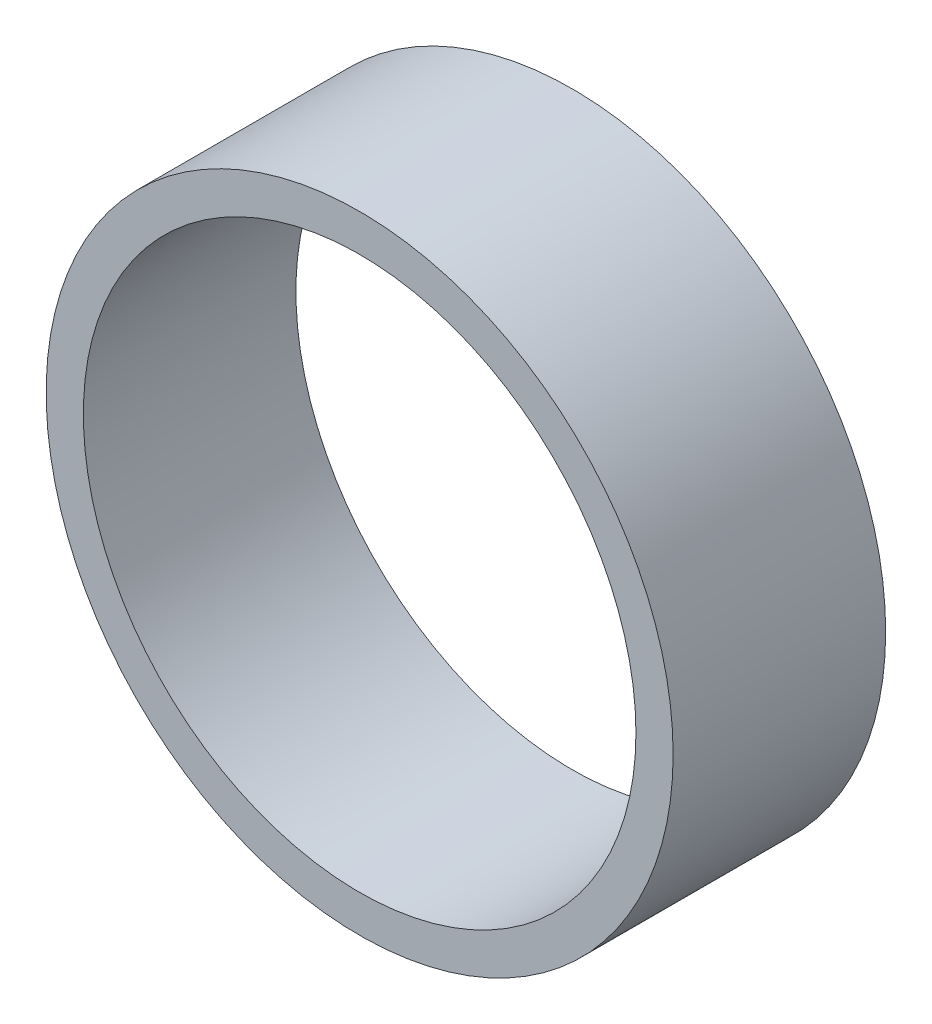
ISO-10303-21;
HEADER;
FILE_DESCRIPTION(('STEP AP214'),'2;1');
FILE_NAME('part.step','',(''),(''),'','','');
FILE_SCHEMA(('AUTOMOTIVE_DESIGN { 1 0 10303 214 1 1 1 1 }'));
ENDSEC;
DATA;
#1=APPLICATION_CONTEXT('core data for automotive mechanical design processes');
#2=APPLICATION_PROTOCOL_DEFINITION('international standard','automotive_design',2000,#1);
#3=PRODUCT_CONTEXT('',#1,'mechanical');
#4=PRODUCT('Part','Part','',(#3));
#5=PRODUCT_RELATED_PRODUCT_CATEGORY('part','',(#4));
#6=PRODUCT_DEFINITION_FORMATION('','',#4);
#7=PRODUCT_DEFINITION_CONTEXT('part definition',#1,'design');
#8=PRODUCT_DEFINITION('design','',#6,#7);
#9=PRODUCT_DEFINITION_SHAPE('','',#8);
#10=(LENGTH_UNIT() NAMED_UNIT(*) SI_UNIT(.MILLI.,.METRE.));
#11=(NAMED_UNIT(*) PLANE_ANGLE_UNIT() SI_UNIT($,.RADIAN.));
#12=(NAMED_UNIT(*) SI_UNIT($,.STERADIAN.) SOLID_ANGLE_UNIT());
#13=UNCERTAINTY_MEASURE_WITH_UNIT(LENGTH_MEASURE(1.E-05),#10,'distance_accuracy_value','');
#14=(GEOMETRIC_REPRESENTATION_CONTEXT(3) GLOBAL_UNCERTAINTY_ASSIGNED_CONTEXT((#13)) GLOBAL_UNIT_ASSIGNED_CONTEXT((#10,
#11,#12)) REPRESENTATION_CONTEXT('',''));
#15=CARTESIAN_POINT('',(0.,0.,0.));
#16=DIRECTION('',(0.,0.,1.));
#17=DIRECTION('',(1.,0.,0.));
#18=AXIS2_PLACEMENT_3D('',#15,#16,#17);
#19=CARTESIAN_POINT('',(0.,0.,10.));
#20=DIRECTION('',(0.,0.,1.));
#21=DIRECTION('',(1.,0.,0.));
#22=AXIS2_PLACEMENT_3D('',#19,#20,#21);
#23=PLANE('',#22);
#24=CARTESIAN_POINT('',(0.,0.,10.));
#25=DIRECTION('',(0.,0.,1.));
#26=DIRECTION('',(1.,0.,0.));
#27=AXIS2_PLACEMENT_3D('',#24,#25,#26);
#28=CIRCLE('',#27,14.75);
#29=CARTESIAN_POINT('',(14.75,0.,10.));
#30=VERTEX_POINT('',#29);
#31=EDGE_CURVE('E10',#30,#30,#28,.T.);
#32=ORIENTED_EDGE('',*,*,#31,.T.);
#33=EDGE_LOOP('',(#32));
#34=FACE_BOUND('',#33,.T.);
#35=CARTESIAN_POINT('',(0.,0.,10.));
#36=DIRECTION('',(0.,0.,1.));
#37=DIRECTION('',(1.,0.,0.));
#38=AXIS2_PLACEMENT_3D('',#35,#36,#37);
#39=CIRCLE('',#38,13.);
#40=CARTESIAN_POINT('',(13.,0.,10.));
#41=VERTEX_POINT('',#40);
#42=EDGE_CURVE('E54',#41,#41,#39,.T.);
#43=ORIENTED_EDGE('',*,*,#42,.F.);
#44=EDGE_LOOP('',(#43));
#45=FACE_BOUND('',#44,.T.);
#46=ADVANCED_FACE('F41',(#34,#45),#23,.T.);
#47=CARTESIAN_POINT('',(0.,0.,0.));
#48=DIRECTION('',(0.,0.,1.));
#49=DIRECTION('',(1.,0.,0.));
#50=AXIS2_PLACEMENT_3D('',#47,#48,#49);
#51=PLANE('',#50);
#52=CARTESIAN_POINT('',(0.,0.,0.));
#53=DIRECTION('',(0.,0.,1.));
#54=DIRECTION('',(1.,0.,0.));
#55=AXIS2_PLACEMENT_3D('',#52,#53,#54);
#56=CIRCLE('',#55,14.75);
#57=CARTESIAN_POINT('',(14.75,0.,0.));
#58=VERTEX_POINT('',#57);
#59=EDGE_CURVE('E45',#58,#58,#56,.T.);
#60=ORIENTED_EDGE('',*,*,#59,.F.);
#61=EDGE_LOOP('',(#60));
#62=FACE_BOUND('',#61,.T.);
#63=CARTESIAN_POINT('',(0.,0.,0.));
#64=DIRECTION('',(0.,0.,1.));
#65=DIRECTION('',(1.,0.,0.));
#66=AXIS2_PLACEMENT_3D('',#63,#64,#65);
#67=CIRCLE('',#66,13.);
#68=CARTESIAN_POINT('',(13.,0.,0.));
#69=VERTEX_POINT('',#68);
#70=EDGE_CURVE('E56',#69,#69,#67,.T.);
#71=ORIENTED_EDGE('',*,*,#70,.T.);
#72=EDGE_LOOP('',(#71));
#73=FACE_BOUND('',#72,.T.);
#74=ADVANCED_FACE('F68',(#62,#73),#51,.F.);
#75=CARTESIAN_POINT('',(0.,0.,10.));
#76=DIRECTION('',(0.,0.,-1.));
#77=DIRECTION('',(-1.,0.,0.));
#78=AXIS2_PLACEMENT_3D('',#75,#76,#77);
#79=CYLINDRICAL_SURFACE('',#78,14.75);
#80=ORIENTED_EDGE('',*,*,#31,.F.);
#81=EDGE_LOOP('',(#80));
#82=FACE_BOUND('',#81,.T.);
#83=ORIENTED_EDGE('',*,*,#59,.T.);
#84=EDGE_LOOP('',(#83));
#85=FACE_BOUND('',#84,.T.);
#86=ADVANCED_FACE('F43',(#82,#85),#79,.T.);
#87=CARTESIAN_POINT('',(0.,0.,10.));
#88=DIRECTION('',(0.,0.,-1.));
#89=DIRECTION('',(-1.,0.,0.));
#90=AXIS2_PLACEMENT_3D('',#87,#88,#89);
#91=CYLINDRICAL_SURFACE('',#90,13.);
#92=ORIENTED_EDGE('',*,*,#42,.T.);
#93=EDGE_LOOP('',(#92));
#94=FACE_BOUND('',#93,.T.);
#95=ORIENTED_EDGE('',*,*,#70,.F.);
#96=EDGE_LOOP('',(#95));
#97=FACE_BOUND('',#96,.T.);
#98=ADVANCED_FACE('F64',(#94,#97),#91,.F.);
#99=CLOSED_SHELL('',(#46,#74,#86,#98));
#100=MANIFOLD_SOLID_BREP('B2',#99);
#101=ADVANCED_BREP_SHAPE_REPRESENTATION('',(#18,#100),#14);
#102=SHAPE_DEFINITION_REPRESENTATION(#9,#101);
ENDSEC;
END-ISO-10303-21;
